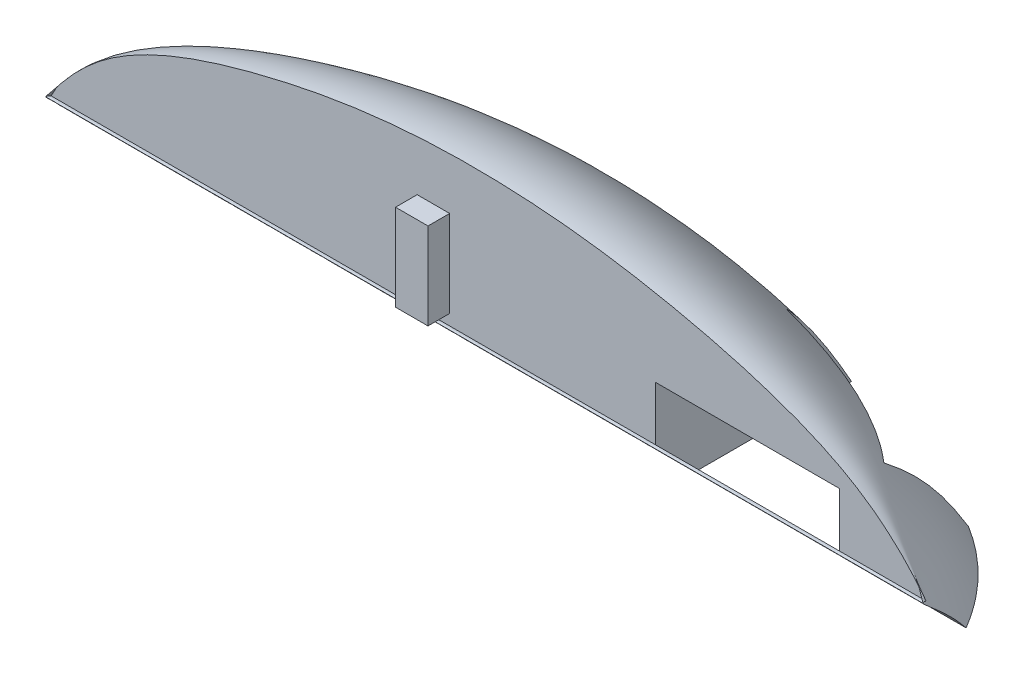
ISO-10303-21;
HEADER;
FILE_DESCRIPTION(('STEP AP214'),'2;1');
FILE_NAME('part.step','',(''),(''),'','','');
FILE_SCHEMA(('AUTOMOTIVE_DESIGN { 1 0 10303 214 1 1 1 1 }'));
ENDSEC;
DATA;
#1=APPLICATION_CONTEXT('core data for automotive mechanical design processes');
#2=APPLICATION_PROTOCOL_DEFINITION('international standard','automotive_design',2000,#1);
#3=PRODUCT_CONTEXT('',#1,'mechanical');
#4=PRODUCT('Part','Part','',(#3));
#5=PRODUCT_RELATED_PRODUCT_CATEGORY('part','',(#4));
#6=PRODUCT_DEFINITION_FORMATION('','',#4);
#7=PRODUCT_DEFINITION_CONTEXT('part definition',#1,'design');
#8=PRODUCT_DEFINITION('design','',#6,#7);
#9=PRODUCT_DEFINITION_SHAPE('','',#8);
#10=(LENGTH_UNIT() NAMED_UNIT(*) SI_UNIT(.MILLI.,.METRE.));
#11=(NAMED_UNIT(*) PLANE_ANGLE_UNIT() SI_UNIT($,.RADIAN.));
#12=(NAMED_UNIT(*) SI_UNIT($,.STERADIAN.) SOLID_ANGLE_UNIT());
#13=UNCERTAINTY_MEASURE_WITH_UNIT(LENGTH_MEASURE(1.E-05),#10,'distance_accuracy_value','');
#14=(GEOMETRIC_REPRESENTATION_CONTEXT(3) GLOBAL_UNCERTAINTY_ASSIGNED_CONTEXT((#13)) GLOBAL_UNIT_ASSIGNED_CONTEXT((#10,
#11,#12)) REPRESENTATION_CONTEXT('',''));
#15=CARTESIAN_POINT('',(0.,0.,0.));
#16=DIRECTION('',(0.,0.,1.));
#17=DIRECTION('',(1.,0.,0.));
#18=AXIS2_PLACEMENT_3D('',#15,#16,#17);
#19=CARTESIAN_POINT('',(20.25011525,25.453580483249,-30.));
#20=DIRECTION('',(0.,0.,1.));
#21=DIRECTION('',(-1.,0.,0.));
#22=AXIS2_PLACEMENT_3D('',#19,#20,#21);
#23=PLANE('',#22);
#24=DIRECTION('',(-1.,0.,0.));
#25=VECTOR('',#24,1.);
#26=CARTESIAN_POINT('',(36.5,24.5,-30.));
#27=LINE('',#26,#25);
#28=CARTESIAN_POINT('',(36.5,24.5,-30.));
#29=VERTEX_POINT('',#28);
#30=CARTESIAN_POINT('',(28.,24.5,-30.));
#31=VERTEX_POINT('',#30);
#32=EDGE_CURVE('E165',#29,#31,#27,.T.);
#33=ORIENTED_EDGE('',*,*,#32,.F.);
#34=DIRECTION('',(0.,-1.,0.));
#35=VECTOR('',#34,1.);
#36=CARTESIAN_POINT('',(36.5,24.5,-30.));
#37=LINE('',#36,#35);
#38=CARTESIAN_POINT('',(36.5,22.,-30.));
#39=VERTEX_POINT('',#38);
#40=EDGE_CURVE('E177',#29,#39,#37,.T.);
#41=ORIENTED_EDGE('',*,*,#40,.T.);
#42=CARTESIAN_POINT('',(40.5,22.,-30.));
#43=CARTESIAN_POINT('',(27.0000768333334,22.,-30.));
#44=CARTESIAN_POINT('',(13.5001536666667,22.,-30.));
#45=CARTESIAN_POINT('',(0.000230500000000689,22.,-30.));
#46=B_SPLINE_CURVE_WITH_KNOTS('',3,(#42,#43,#44,#45),.UNSPECIFIED.,.F.,.F.,(4,4),(0.,1.),.UNSPECIFIED.);
#47=CARTESIAN_POINT('',(40.5,22.,-30.));
#48=VERTEX_POINT('',#47);
#49=EDGE_CURVE('E279',#39,#48,#46,.F.);
#50=ORIENTED_EDGE('',*,*,#49,.T.);
#51=CARTESIAN_POINT('',(0.000230500000000689,22.,-30.));
#52=CARTESIAN_POINT('',(0.739150769022203,23.03726321863,-30.));
#53=CARTESIAN_POINT('',(3.12649338618059,25.6439685121812,-30.));
#54=CARTESIAN_POINT('',(11.4702662698805,28.4720776969719,-30.));
#55=CARTESIAN_POINT('',(19.7044952136281,29.2399964366831,-30.));
#56=CARTESIAN_POINT('',(28.4856403512339,28.2163806083618,-30.));
#57=CARTESIAN_POINT('',(36.7942535663366,25.8303513659763,-30.));
#58=CARTESIAN_POINT('',(39.5504796655932,23.244792146525,-30.));
#59=CARTESIAN_POINT('',(40.5,22.,-30.));
#60=B_SPLINE_CURVE_WITH_KNOTS('',3,(#51,#52,#53,#54,#55,#56,#57,#58,#59),.UNSPECIFIED.,.F.,.F.,
(4,1,1,1,1,1,4),(0.,0.087898590956398,0.25059951239453,0.529512710556187,0.714586405415059,
0.881767774039842,1.),.UNSPECIFIED.);
#61=CARTESIAN_POINT('',(0.000230500000000689,22.,-30.));
#62=VERTEX_POINT('',#61);
#63=EDGE_CURVE('E305',#48,#62,#60,.F.);
#64=ORIENTED_EDGE('',*,*,#63,.T.);
#65=CARTESIAN_POINT('',(40.5,22.,-30.));
#66=CARTESIAN_POINT('',(27.0000768333334,22.,-30.));
#67=CARTESIAN_POINT('',(13.5001536666667,22.,-30.));
#68=CARTESIAN_POINT('',(0.000230500000000689,22.,-30.));
#69=B_SPLINE_CURVE_WITH_KNOTS('',3,(#65,#66,#67,#68),.UNSPECIFIED.,.F.,.F.,(4,4),(0.,1.),.UNSPECIFIED.);
#70=CARTESIAN_POINT('',(28.,22.,-30.));
#71=VERTEX_POINT('',#70);
#72=EDGE_CURVE('E293',#62,#71,#69,.F.);
#73=ORIENTED_EDGE('',*,*,#72,.T.);
#74=DIRECTION('',(0.,-1.,0.));
#75=VECTOR('',#74,1.);
#76=CARTESIAN_POINT('',(28.,24.5,-30.));
#77=LINE('',#76,#75);
#78=EDGE_CURVE('E420',#31,#71,#77,.T.);
#79=ORIENTED_EDGE('',*,*,#78,.F.);
#80=EDGE_LOOP('',(#33,#41,#50,#64,#73,#79));
#81=FACE_BOUND('',#80,.T.);
#82=DIRECTION('',(-1.,0.,0.));
#83=VECTOR('',#82,1.);
#84=CARTESIAN_POINT('',(20.25011525,22.5,-30.));
#85=LINE('',#84,#83);
#86=CARTESIAN_POINT('',(18.5,22.5,-30.));
#87=VERTEX_POINT('',#86);
#88=CARTESIAN_POINT('',(17.,22.5,-30.));
#89=VERTEX_POINT('',#88);
#90=EDGE_CURVE('E409',#87,#89,#85,.T.);
#91=ORIENTED_EDGE('',*,*,#90,.T.);
#92=DIRECTION('',(0.,1.,0.));
#93=VECTOR('',#92,1.);
#94=CARTESIAN_POINT('',(17.,25.453580483249,-30.));
#95=LINE('',#94,#93);
#96=CARTESIAN_POINT('',(17.,26.5,-30.));
#97=VERTEX_POINT('',#96);
#98=EDGE_CURVE('E11',#89,#97,#95,.T.);
#99=ORIENTED_EDGE('',*,*,#98,.T.);
#100=DIRECTION('',(1.,0.,0.));
#101=VECTOR('',#100,1.);
#102=CARTESIAN_POINT('',(20.25011525,26.5,-30.));
#103=LINE('',#102,#101);
#104=CARTESIAN_POINT('',(18.5,26.5,-30.));
#105=VERTEX_POINT('',#104);
#106=EDGE_CURVE('E27',#97,#105,#103,.T.);
#107=ORIENTED_EDGE('',*,*,#106,.T.);
#108=DIRECTION('',(0.,-1.,0.));
#109=VECTOR('',#108,1.);
#110=CARTESIAN_POINT('',(18.5,25.453580483249,-30.));
#111=LINE('',#110,#109);
#112=EDGE_CURVE('E415',#105,#87,#111,.T.);
#113=ORIENTED_EDGE('',*,*,#112,.T.);
#114=EDGE_LOOP('',(#91,#99,#107,#113));
#115=FACE_BOUND('',#114,.T.);
#116=ADVANCED_FACE('F17',(#81,#115),#23,.T.);
#117=CARTESIAN_POINT('',(0.,20.,0.));
#118=DIRECTION('',(0.,1.,0.));
#119=DIRECTION('',(0.,0.,1.));
#120=AXIS2_PLACEMENT_3D('',#117,#118,#119);
#121=PLANE('',#120);
#122=DIRECTION('',(0.,0.,-1.));
#123=VECTOR('',#122,1.);
#124=CARTESIAN_POINT('',(28.,20.,-30.));
#125=LINE('',#124,#123);
#126=CARTESIAN_POINT('',(28.,20.,-31.8493692518598));
#127=VERTEX_POINT('',#126);
#128=CARTESIAN_POINT('',(28.,20.,-39.0596281540542));
#129=VERTEX_POINT('',#128);
#130=EDGE_CURVE('E156',#127,#129,#125,.T.);
#131=ORIENTED_EDGE('',*,*,#130,.F.);
#132=DIRECTION('',(1.,0.,0.));
#133=VECTOR('',#132,1.);
#134=CARTESIAN_POINT('',(20.2501152496914,20.,-31.8493692487916));
#135=LINE('',#134,#133);
#136=CARTESIAN_POINT('',(0.000230497181969574,20.,-31.8493692487916));
#137=VERTEX_POINT('',#136);
#138=EDGE_CURVE('E371',#137,#127,#135,.T.);
#139=ORIENTED_EDGE('',*,*,#138,.F.);
#140=CARTESIAN_POINT('',(18.7825989830446,19.9999999978192,-39.9999999920742));
#141=CARTESIAN_POINT('',(18.4673231550345,19.9999999992085,-39.9936145308374));
#142=CARTESIAN_POINT('',(18.1521331823791,19.999999999786,-39.9829764414258));
#143=CARTESIAN_POINT('',(17.5226090192361,20.0000000002137,-39.9530312704488));
#144=CARTESIAN_POINT('',(17.2082742484702,20.0000000000649,-39.9337363605383));
#145=CARTESIAN_POINT('',(16.4732250865418,19.9999999999129,-39.8782116963993));
#146=CARTESIAN_POINT('',(16.0527718918708,19.9999999999767,-39.8384512996698));
#147=CARTESIAN_POINT('',(15.213582565402,20.0000000000233,-39.7429387784612));
#148=CARTESIAN_POINT('',(14.7948469019338,20.0000000000063,-39.687182552734));
#149=CARTESIAN_POINT('',(13.9597670221921,19.9999999999937,-39.5599431591359));
#150=CARTESIAN_POINT('',(13.5434228489191,19.9999999999983,-39.4884597093827));
#151=CARTESIAN_POINT('',(12.7115695918937,20.0000000000017,-39.3299268132945));
#152=CARTESIAN_POINT('',(12.2960749612457,20.0000000000005,-39.242801714024));
#153=CARTESIAN_POINT('',(11.4684224640325,19.9999999999995,-39.0540004871884));
#154=CARTESIAN_POINT('',(11.0562645360078,19.9999999999999,-38.9523246282843));
#155=CARTESIAN_POINT('',(10.2355279821689,20.0000000000001,-38.7353845324986));
#156=CARTESIAN_POINT('',(9.82694954722567,20.,-38.6201195756807));
#157=CARTESIAN_POINT('',(9.09841260100675,20.,-38.4022243018996));
#158=CARTESIAN_POINT('',(8.77774219139659,20.,-38.3019720200288));
#159=CARTESIAN_POINT('',(8.13971269687509,20.,-38.0914823290324));
#160=CARTESIAN_POINT('',(7.82235317927318,20.,-37.9812462433613));
#161=CARTESIAN_POINT('',(7.19189902779983,20.,-37.7487588729626));
#162=CARTESIAN_POINT('',(6.87880605634362,20.,-37.6265030491478));
#163=CARTESIAN_POINT('',(6.26069593102699,20.,-37.3687546421392));
#164=CARTESIAN_POINT('',(5.95563704750669,20.,-37.2333629253999));
#165=CARTESIAN_POINT('',(5.35329288604292,20.,-36.9463270496865));
#166=CARTESIAN_POINT('',(5.05600585386223,20.,-36.7946865984211));
#167=CARTESIAN_POINT('',(4.47182811681479,20.,-36.4726666893887));
#168=CARTESIAN_POINT('',(4.18493243645207,20.,-36.302296361701));
#169=CARTESIAN_POINT('',(3.71673323049314,20.,-35.9995697467725));
#170=CARTESIAN_POINT('',(3.53165157254729,20.,-35.8730656807282));
#171=CARTESIAN_POINT('',(3.25971368206582,20.,-35.6755361068861));
#172=CARTESIAN_POINT('',(3.17002052259094,20.,-35.608401728672));
#173=CARTESIAN_POINT('',(2.99270105668744,20.,-35.471452255226));
#174=CARTESIAN_POINT('',(2.90507473745273,20.,-35.4016371766106));
#175=CARTESIAN_POINT('',(2.73212230000936,20.,-35.2592687155737));
#176=CARTESIAN_POINT('',(2.64679540450332,20.,-35.1867162789095));
#177=CARTESIAN_POINT('',(2.47860360423579,20.,-35.0388171415569));
#178=CARTESIAN_POINT('',(2.39573869949264,20.,-34.9634704408476));
#179=CARTESIAN_POINT('',(2.15075680793448,20.,-34.7333193982494));
#180=CARTESIAN_POINT('',(1.9923766070967,20.0000000000001,-34.5745062448021));
#181=CARTESIAN_POINT('',(1.68571710757864,19.9999999999999,-34.2473134713051));
#182=CARTESIAN_POINT('',(1.5374426886795,19.9999999999997,-34.0789293006639));
#183=CARTESIAN_POINT('',(1.2509494266091,20.0000000000003,-33.7338916703542));
#184=CARTESIAN_POINT('',(1.11272853076684,20.0000000000011,-33.5572399108883));
#185=CARTESIAN_POINT('',(0.79914320704978,19.9999999999985,-33.1334873873139));
#186=CARTESIAN_POINT('',(0.627779853671464,19.9999999999936,-32.8834311951474));
#187=CARTESIAN_POINT('',(0.301858369559208,20.0000000000064,-32.3733526592436));
#188=CARTESIAN_POINT('',(0.147263602268068,20.000000000024,-32.1133537925674));
#189=CARTESIAN_POINT('',(0.000230499691400271,20.0000000000674,-31.8493692424113));
#190=B_SPLINE_CURVE_WITH_KNOTS('',3,(#140,#141,#142,#143,#144,#145,#146,#147,#148,#149,#150,
#151,#152,#153,#154,#155,#156,#157,#158,#159,#160,#161,#162,#163,#164,#165,#166,#167,#168,#169,
#170,#171,#172,#173,#174,#175,#176,#177,#178,#179,#180,#181,#182,#183,#184,#185,#186,#187,#188,
#189),.UNSPECIFIED.,.F.,.F.,(4,2,2,2,2,2,2,2,2,2,2,2,2,2,2,2,2,2,2,2,2,2,2,2,4),(0.,
0.945990238946583,1.89065454564998,3.15732237117926,4.42431525449823,5.69133084825386,
6.96464825495112,8.23794215451415,9.51130354221055,10.5191140837438,11.5267912247493,
12.5348503734525,13.5357036751103,14.5363290819855,15.5364688681046,16.2086753238537,
16.5447369872613,16.8807965678924,17.2167410844742,17.5526856035576,18.225055548756,
18.8977478942763,19.5703025055057,20.4790304525625,21.3857311951022),.UNSPECIFIED.);
#191=CARTESIAN_POINT('',(18.7835162951009,20.,-40.));
#192=VERTEX_POINT('',#191);
#193=EDGE_CURVE('E339',#192,#137,#190,.T.);
#194=ORIENTED_EDGE('',*,*,#193,.F.);
#195=DIRECTION('',(-1.,0.,0.));
#196=VECTOR('',#195,1.);
#197=CARTESIAN_POINT('',(40.5,20.,-40.));
#198=LINE('',#197,#196);
#199=CARTESIAN_POINT('',(20.2499994144658,20.0000082664164,-40.0000150216028));
#200=VERTEX_POINT('',#199);
#201=EDGE_CURVE('E232',#200,#192,#198,.T.);
#202=ORIENTED_EDGE('',*,*,#201,.F.);
#203=CARTESIAN_POINT('',(40.4999999997161,16.6736548830317,-33.9554175833377));
#204=CARTESIAN_POINT('',(39.5504796650203,17.273796309124,-35.0459852136064));
#205=CARTESIAN_POINT('',(36.7942535651638,18.5203507651671,-37.3112045102973));
#206=CARTESIAN_POINT('',(28.4856403495073,19.6707074695508,-39.401614754483));
#207=CARTESIAN_POINT('',(19.704495211664,20.1642149708474,-40.2984088813494));
#208=CARTESIAN_POINT('',(11.4702662680946,19.7939846074181,-39.6256320448502));
#209=CARTESIAN_POINT('',(3.12649338505101,18.4304915250546,-37.1479137020203));
#210=CARTESIAN_POINT('',(0.739150768497569,17.1737420851977,-34.8641682399041));
#211=CARTESIAN_POINT('',(0.000230499716088509,16.6736548785001,-33.9554175751033));
#212=B_SPLINE_CURVE_WITH_KNOTS('',3,(#203,#204,#205,#206,#207,#208,#209,#210,#211),
.UNSPECIFIED.,.F.,.F.,(4,1,1,1,1,1,4),(0.,0.118232225960158,0.285413594584941,0.470487289443813,
0.74940048760547,0.912101409043602,1.),.UNSPECIFIED.);
#213=CARTESIAN_POINT('',(20.2540027573121,19.9999916122397,-39.9999847578929));
#214=VERTEX_POINT('',#213);
#215=EDGE_CURVE('E334',#214,#200,#212,.T.);
#216=ORIENTED_EDGE('',*,*,#215,.F.);
#217=CARTESIAN_POINT('',(40.4999999996914,20.0000000001187,-31.849369254928));
#218=CARTESIAN_POINT('',(40.4456788618527,20.0000000000428,-31.9404736822134));
#219=CARTESIAN_POINT('',(40.3903350398536,20.0000000000115,-32.0309744407622));
#220=CARTESIAN_POINT('',(40.2775784913579,19.9999999999885,-32.2106650972197));
#221=CARTESIAN_POINT('',(40.2201659681718,19.9999999999968,-32.29985512274));
#222=CARTESIAN_POINT('',(40.1032428960012,20.0000000000032,-32.4768310393799));
#223=CARTESIAN_POINT('',(40.0437325287336,20.0000000000012,-32.5646170511633));
#224=CARTESIAN_POINT('',(39.8012643206628,19.9999999999963,-32.912979140251));
#225=CARTESIAN_POINT('',(39.6096586715204,19.9999999999992,-33.1676712129529));
#226=CARTESIAN_POINT('',(39.2720037145106,20.0000000000005,-33.581131742151));
#227=CARTESIAN_POINT('',(39.1312672585176,20.0000000000001,-33.7442788249879));
#228=CARTESIAN_POINT('',(38.840886749941,19.9999999999999,-34.0625648675241));
#229=CARTESIAN_POINT('',(38.6912399726672,20.,-34.2177013502992));
#230=CARTESIAN_POINT('',(38.3834239009352,20.,-34.5192323464502));
#231=CARTESIAN_POINT('',(38.2252557241043,20.,-34.6656280009486));
#232=CARTESIAN_POINT('',(37.9008449280116,20.,-34.94924661779));
#233=CARTESIAN_POINT('',(37.7346006200494,20.,-35.0864676473625));
#234=CARTESIAN_POINT('',(37.3947065034437,20.,-35.3514296101557));
#235=CARTESIAN_POINT('',(37.2210564798882,20.,-35.4791702679635));
#236=CARTESIAN_POINT('',(36.9556074897127,20.,-35.663571788321));
#237=CARTESIAN_POINT('',(36.8662914868849,20.,-35.7238398613313));
#238=CARTESIAN_POINT('',(36.6861169502157,20.,-35.8420310141942));
#239=CARTESIAN_POINT('',(36.5952583702901,20.,-35.899954023813));
#240=CARTESIAN_POINT('',(36.3503127755092,20.,-36.0519992661687));
#241=CARTESIAN_POINT('',(36.1949886892471,20.,-36.1441332323484));
#242=CARTESIAN_POINT('',(35.8811413972902,20.,-36.3227800249888));
#243=CARTESIAN_POINT('',(35.722617885367,20.,-36.4092923100023));
#244=CARTESIAN_POINT('',(35.2427593107097,20.,-36.6613275360255));
#245=CARTESIAN_POINT('',(34.917388270314,20.,-36.8191952315444));
#246=CARTESIAN_POINT('',(34.2588633494019,20.,-37.1179628044953));
#247=CARTESIAN_POINT('',(33.9257056832928,20.,-37.2588542147692));
#248=CARTESIAN_POINT('',(33.2517433503016,20.,-37.5270181167959));
#249=CARTESIAN_POINT('',(32.9109055230177,20.,-37.6542068178274));
#250=CARTESIAN_POINT('',(32.225108856402,20.,-37.8960382640916));
#251=CARTESIAN_POINT('',(31.8801531054112,20.,-38.0106898276082));
#252=CARTESIAN_POINT('',(31.1869028389962,20.,-38.2291961284611));
#253=CARTESIAN_POINT('',(30.8386087220515,20.,-38.3330521372881));
#254=CARTESIAN_POINT('',(30.0750797699906,20.,-38.5495158046022));
#255=CARTESIAN_POINT('',(29.6593070569421,20.,-38.6602236991153));
#256=CARTESIAN_POINT('',(29.0334958551283,20.,-38.8177001865078));
#257=CARTESIAN_POINT('',(28.8245232975736,20.,-38.8687637132413));
#258=CARTESIAN_POINT('',(28.4058842866439,20.,-38.9679610138526));
#259=CARTESIAN_POINT('',(28.1962178383448,20.,-39.0160948091114));
#260=CARTESIAN_POINT('',(27.5680698446919,20.,-39.1554643809518));
#261=CARTESIAN_POINT('',(27.1485657565305,20.,-39.2421419782322));
#262=CARTESIAN_POINT('',(26.3070697471562,20.,-39.4023321547466));
#263=CARTESIAN_POINT('',(25.8850779836666,20.,-39.4758455595371));
#264=CARTESIAN_POINT('',(25.1754380488316,20.,-39.5874539646822));
#265=CARTESIAN_POINT('',(24.8883795567118,20.,-39.6293233080992));
#266=CARTESIAN_POINT('',(24.3133681970171,20.,-39.7065020944657));
#267=CARTESIAN_POINT('',(24.0254152964494,20.,-39.741811292434));
#268=CARTESIAN_POINT('',(23.4487644995293,20.,-39.8057769994519));
#269=CARTESIAN_POINT('',(23.1600665847809,20.,-39.8344333426102));
#270=CARTESIAN_POINT('',(22.5804828410065,20.,-39.8852398386457));
#271=CARTESIAN_POINT('',(22.2895937693376,20.,-39.9073529481434));
#272=CARTESIAN_POINT('',(21.7073904931713,20.,-39.9449644388807));
#273=CARTESIAN_POINT('',(21.4160762929801,20.,-39.9604628866606));
#274=CARTESIAN_POINT('',(20.9789158048458,20.,-39.9789316296431));
#275=CARTESIAN_POINT('',(20.8331665245896,20.,-39.9842913400283));
#276=CARTESIAN_POINT('',(20.541617647598,20.,-39.9933791073756));
#277=CARTESIAN_POINT('',(20.3958180510267,20.,-39.9971071696109));
#278=CARTESIAN_POINT('',(20.2500000000005,20.,-40.));
#279=B_SPLINE_CURVE_WITH_KNOTS('',3,(#217,#218,#219,#220,#221,#222,#223,#224,#225,#226,#227,
#228,#229,#230,#231,#232,#233,#234,#235,#236,#237,#238,#239,#240,#241,#242,#243,#244,#245,#246,
#247,#248,#249,#250,#251,#252,#253,#254,#255,#256,#257,#258,#259,#260,#261,#262,#263,#264,#265,
#266,#267,#268,#269,#270,#271,#272,#273,#274,#275,#276,#277,#278),.UNSPECIFIED.,.F.,.F.,(4,2,2,
2,2,2,2,2,2,2,2,2,2,2,2,2,2,2,2,2,2,2,2,2,2,2,2,2,2,2,4),(0.,0.318212264480111,
0.636393340139591,0.954546922108443,1.90957814873258,2.55567667621228,3.20197379928719,
3.84818636240443,4.4945346336026,5.14090167443684,5.4641134576125,5.78733491372048,
6.32897358133186,6.87066433930362,7.95492963805252,9.03973351006887,10.1308336116052,
11.221161258186,12.3113603411105,13.6019308942755,14.2472784502336,14.8926212959345,
16.1775107104988,17.4623195184718,18.3325380105599,19.2027889934474,20.0730616740516,
20.9481709145772,21.8232713517054,22.260807087793,22.6983414098539),.UNSPECIFIED.);
#280=EDGE_CURVE('E340',#129,#214,#279,.T.);
#281=ORIENTED_EDGE('',*,*,#280,.F.);
#282=EDGE_LOOP('',(#131,#139,#194,#202,#216,#281));
#283=FACE_BOUND('',#282,.T.);
#284=ADVANCED_FACE('F216',(#283),#121,.F.);
#285=DIRECTION('',(0.,0.,1.));
#286=VECTOR('',#285,1.);
#287=CARTESIAN_POINT('',(36.5,20.,-39.5898905600885));
#288=LINE('',#287,#286);
#289=CARTESIAN_POINT('',(36.5,20.,-35.9590830150765));
#290=VERTEX_POINT('',#289);
#291=CARTESIAN_POINT('',(36.5,20.,-31.8493692518598));
#292=VERTEX_POINT('',#291);
#293=EDGE_CURVE('E161',#290,#292,#288,.T.);
#294=ORIENTED_EDGE('',*,*,#293,.F.);
#295=CARTESIAN_POINT('',(40.5,20.,-31.849369254928));
#296=VERTEX_POINT('',#295);
#297=EDGE_CURVE('E335',#296,#290,#279,.T.);
#298=ORIENTED_EDGE('',*,*,#297,.F.);
#299=EDGE_CURVE('E366',#292,#296,#135,.T.);
#300=ORIENTED_EDGE('',*,*,#299,.F.);
#301=EDGE_LOOP('',(#294,#298,#300));
#302=FACE_BOUND('',#301,.T.);
#303=ADVANCED_FACE('F450',(#302),#121,.F.);
#304=CARTESIAN_POINT('',(20.2501152489146,18.3387013083919,-36.9811139533019));
#305=DIRECTION('',(0.,0.876104202220531,0.482121796698228));
#306=DIRECTION('',(-1.,-1.11891773624251E-10,2.0331852867983E-10));
#307=AXIS2_PLACEMENT_3D('',#304,#305,#306);
#308=PLANE('',#307);
#309=CARTESIAN_POINT('',(40.4999999997161,16.6736548830317,-33.9554175833377));
#310=CARTESIAN_POINT('',(39.5504796650203,17.273796309124,-35.0459852136064));
#311=CARTESIAN_POINT('',(36.7942535651638,18.5203507651671,-37.3112045102973));
#312=CARTESIAN_POINT('',(28.4856403495073,19.6707074695508,-39.401614754483));
#313=CARTESIAN_POINT('',(19.704495211664,20.1642149708474,-40.2984088813494));
#314=CARTESIAN_POINT('',(11.4702662680946,19.7939846074181,-39.6256320448502));
#315=CARTESIAN_POINT('',(3.12649338505101,18.4304915250546,-37.1479137020203));
#316=CARTESIAN_POINT('',(0.739150768497569,17.1737420851977,-34.8641682399041));
#317=CARTESIAN_POINT('',(0.000230499716088509,16.6736548785001,-33.9554175751033));
#318=B_SPLINE_CURVE_WITH_KNOTS('',3,(#309,#310,#311,#312,#313,#314,#315,#316,#317),
.UNSPECIFIED.,.F.,.F.,(4,1,1,1,1,1,4),(0.,0.118232225960158,0.285413594584941,0.470487289443813,
0.74940048760547,0.912101409043602,1.),.UNSPECIFIED.);
#319=EDGE_CURVE('E306',#192,#200,#318,.F.);
#320=ORIENTED_EDGE('',*,*,#319,.T.);
#321=ORIENTED_EDGE('',*,*,#201,.T.);
#322=EDGE_LOOP('',(#320,#321));
#323=FACE_BOUND('',#322,.T.);
#324=ADVANCED_FACE('F19',(#323),#308,.F.);
#325=CARTESIAN_POINT('',(0.000230500000000689,22.,-30.));
#326=CARTESIAN_POINT('',(0.000230500000000652,22.,-29.9948388900879));
#327=CARTESIAN_POINT('',(0.000230500163543397,22.1160702352584,-29.6051916335395));
#328=CARTESIAN_POINT('',(0.000230499507954534,21.2652746975059,-30.7053325517347));
#329=CARTESIAN_POINT('',(0.000230499770870856,19.8719744469128,-32.0768283929598));
#330=CARTESIAN_POINT('',(0.000230499716082116,17.8853002770691,-33.2886468245025));
#331=CARTESIAN_POINT('',(0.000230499716088509,16.6736548785001,-33.9554175751033));
#332=CARTESIAN_POINT('',(13.5001536666667,22.,-30.));
#333=CARTESIAN_POINT('',(13.5001536666667,22.,-29.9948388928607));
#334=CARTESIAN_POINT('',(13.5001536668302,22.1160702342329,-29.6051916397553));
#335=CARTESIAN_POINT('',(13.5001536661746,21.2652746983509,-30.7053325555318));
#336=CARTESIAN_POINT('',(13.5001536664375,19.8719744494963,-32.0768283950455));
#337=CARTESIAN_POINT('',(13.5001536663827,17.8853002785015,-33.2886468272902));
#338=CARTESIAN_POINT('',(13.5001536663828,16.6736548800107,-33.9554175778482));
#339=CARTESIAN_POINT('',(27.0000768333334,22.,-30.));
#340=CARTESIAN_POINT('',(27.0000768333334,22.,-29.9948388956336));
#341=CARTESIAN_POINT('',(27.0000768334969,22.1160702332072,-29.605191645971));
#342=CARTESIAN_POINT('',(27.0000768328413,21.2652746991957,-30.7053325593289));
#343=CARTESIAN_POINT('',(27.0000768331042,19.8719744520799,-32.0768283971311));
#344=CARTESIAN_POINT('',(27.0000768330494,17.885300279934,-33.288646830078));
#345=CARTESIAN_POINT('',(27.0000768330494,16.6736548815212,-33.955417580593));
#346=CARTESIAN_POINT('',(40.5,22.,-30.));
#347=CARTESIAN_POINT('',(40.5,22.,-29.9948388984064));
#348=CARTESIAN_POINT('',(40.5000000001636,22.1160702321816,-29.6051916521867));
#349=CARTESIAN_POINT('',(40.4999999995079,21.2652747000406,-30.7053325631259));
#350=CARTESIAN_POINT('',(40.4999999997708,19.8719744546634,-32.0768283992168));
#351=CARTESIAN_POINT('',(40.4999999997161,17.8853002813665,-33.2886468328657));
#352=CARTESIAN_POINT('',(40.4999999997161,16.6736548830317,-33.9554175833377));
#353=B_SPLINE_SURFACE_WITH_KNOTS('',3,3,((#325,#326,#327,#328,#329,#330,#331),(#332,#333,#334,
#335,#336,#337,#338),(#339,#340,#341,#342,#343,#344,#345),(#346,#347,#348,#349,#350,#351,#352)),
.UNSPECIFIED.,.F.,.F.,.F.,(4,4),(4,1,1,1,4),(0.,1.),(0.,0.251024544191798,0.502049088383596,
0.789400842037647,1.),.UNSPECIFIED.);
#354=CARTESIAN_POINT('',(28.,19.9999999983778,-31.8493692525116));
#355=CARTESIAN_POINT('',(28.,20.0843239901892,-31.781876835971));
#356=CARTESIAN_POINT('',(28.,20.1676877498022,-31.7131716864434));
#357=CARTESIAN_POINT('',(28.,20.3322817818546,-31.5732122792395));
#358=CARTESIAN_POINT('',(28.,20.4135115124514,-31.5019573848111));
#359=CARTESIAN_POINT('',(28.,20.5733451397897,-31.3570232986178));
#360=CARTESIAN_POINT('',(28.,20.6519560911265,-31.2833518988936));
#361=CARTESIAN_POINT('',(28.,20.8066477399576,-31.1334004742009));
#362=CARTESIAN_POINT('',(28.,20.8827284776954,-31.0571204907614));
#363=CARTESIAN_POINT('',(28.,21.0080461403162,-30.9273667911329));
#364=CARTESIAN_POINT('',(28.,21.0579634655945,-30.8745473601886));
#365=CARTESIAN_POINT('',(28.,21.156767201683,-30.7679427897169));
#366=CARTESIAN_POINT('',(28.,21.2056534944974,-30.7141575409473));
#367=CARTESIAN_POINT('',(28.,21.3025849705042,-30.6058156249156));
#368=CARTESIAN_POINT('',(28.,21.3506299686538,-30.5512587925977));
#369=CARTESIAN_POINT('',(28.,21.4462299430441,-30.4414372315934));
#370=CARTESIAN_POINT('',(28.,21.4937830650554,-30.3861708941198));
#371=CARTESIAN_POINT('',(28.,21.5648927678227,-30.3030929295848));
#372=CARTESIAN_POINT('',(28.,21.5885571586536,-30.2753731055125));
#373=CARTESIAN_POINT('',(28.,21.6358871297721,-30.2199351132555));
#374=CARTESIAN_POINT('',(28.,21.6595527100395,-30.1922169450537));
#375=CARTESIAN_POINT('',(28.,21.7069816317011,-30.1368894934578));
#376=CARTESIAN_POINT('',(28.,21.7307449142885,-30.1092801599176));
#377=CARTESIAN_POINT('',(28.,21.7666287261304,-30.0680720890261));
#378=CARTESIAN_POINT('',(28.,21.7786301398122,-30.0543700185062));
#379=CARTESIAN_POINT('',(28.,21.8027673707281,-30.0270839075331));
#380=CARTESIAN_POINT('',(28.,21.8149031936013,-30.0134998720748));
#381=CARTESIAN_POINT('',(28.,21.8271332099329,-30.));
#382=B_SPLINE_CURVE_WITH_KNOTS('',3,(#354,#355,#356,#357,#358,#359,#360,#361,#362,#363,#364,
#365,#366,#367,#368,#369,#370,#371,#372,#373,#374,#375,#376,#377,#378,#379,#380,#381),
.UNSPECIFIED.,.F.,.F.,(4,2,2,2,2,2,2,2,2,2,2,2,2,4),(0.,0.324025691894997,0.648132875892582,
0.971281634922738,1.29442525176533,1.51243568272557,1.73047092981699,1.94855354613446,
2.16727684062388,2.27661824984386,2.38595819496952,2.49523988248875,2.54988368741002,
2.60452979359153),.UNSPECIFIED.);
#383=CARTESIAN_POINT('',(28.,21.8271332074617,-30.));
#384=VERTEX_POINT('',#383);
#385=EDGE_CURVE('E225',#127,#384,#382,.T.);
#386=DIRECTION('',(1.,0.,0.));
#387=VECTOR('',#386,1.);
#388=CARTESIAN_POINT('',(20.2501152499384,21.8271332074617,-29.9999999999972));
#389=LINE('',#388,#387);
#390=CARTESIAN_POINT('',(36.5,21.8271332074617,-30.));
#391=VERTEX_POINT('',#390);
#392=EDGE_CURVE('E404',#384,#391,#389,.T.);
#393=CARTESIAN_POINT('',(36.5,21.8271332126461,-30.));
#394=CARTESIAN_POINT('',(36.5,21.8128782759767,-30.015740764839));
#395=CARTESIAN_POINT('',(36.5,21.7987474626214,-30.0315921022985));
#396=CARTESIAN_POINT('',(36.5,21.7706562900443,-30.0634439358196));
#397=CARTESIAN_POINT('',(36.5,21.7566959222998,-30.0794444243521));
#398=CARTESIAN_POINT('',(36.5,21.7149562295294,-30.1275588051827));
#399=CARTESIAN_POINT('',(36.5,21.6873137138612,-30.1597907964567));
#400=CARTESIAN_POINT('',(36.5,21.6321354766198,-30.2243079644002));
#401=CARTESIAN_POINT('',(36.5,21.6045996955082,-30.2565930904183));
#402=CARTESIAN_POINT('',(36.5,21.5494745200633,-30.3211241421602));
#403=CARTESIAN_POINT('',(36.5,21.5218851196667,-30.3533700626889));
#404=CARTESIAN_POINT('',(36.5,21.4184539720062,-30.4737061714788));
#405=CARTESIAN_POINT('',(36.5,21.3421367532789,-30.5613919992475));
#406=CARTESIAN_POINT('',(36.5,21.1873286225927,-30.7348281207941));
#407=CARTESIAN_POINT('',(36.5,21.1088378439017,-30.820578532656));
#408=CARTESIAN_POINT('',(36.5,20.9490418392496,-30.989385753511));
#409=CARTESIAN_POINT('',(36.5,20.8677373095092,-31.0724432191201));
#410=CARTESIAN_POINT('',(36.5,20.7019766412295,-31.2357364899881));
#411=CARTESIAN_POINT('',(36.5,20.6175137741799,-31.3159654697783));
#412=CARTESIAN_POINT('',(36.5,20.4457213507671,-31.473392454693));
#413=CARTESIAN_POINT('',(36.5,20.3583901116813,-31.5505886201346));
#414=CARTESIAN_POINT('',(36.5,20.1810824485317,-31.7021222570832));
#415=CARTESIAN_POINT('',(36.5,20.0911027231007,-31.7764558688973));
#416=CARTESIAN_POINT('',(36.5,20.,-31.8493692538685));
#417=B_SPLINE_CURVE_WITH_KNOTS('',3,(#393,#394,#395,#396,#397,#398,#399,#400,#401,#402,#403,
#404,#405,#406,#407,#408,#409,#410,#411,#412,#413,#414,#415,#416),.UNSPECIFIED.,.F.,.F.,(4,2,2,
2,2,2,2,2,2,2,2,4),(0.,0.0637059523027047,0.127408705974231,0.25479342176762,0.382092066691871,
0.509406058261527,0.858123550406088,1.20681970871032,1.55543019572867,1.90483119073564,
2.2544409565566,2.60450669238659),.UNSPECIFIED.);
#418=EDGE_CURVE('E191',#391,#292,#417,.T.);
#419=CARTESIAN_POINT('',(40.5,22.,-30.));
#420=CARTESIAN_POINT('',(40.5,22.,-29.9948388984064));
#421=CARTESIAN_POINT('',(40.5000000001636,22.1160702321816,-29.6051916521867));
#422=CARTESIAN_POINT('',(40.4999999995079,21.2652747000406,-30.7053325631259));
#423=CARTESIAN_POINT('',(40.4999999997708,19.8719744546634,-32.0768283992168));
#424=CARTESIAN_POINT('',(40.4999999997161,17.8853002813665,-33.2886468328657));
#425=CARTESIAN_POINT('',(40.4999999997161,16.6736548830317,-33.9554175833377));
#426=B_SPLINE_CURVE_WITH_KNOTS('',3,(#419,#420,#421,#422,#423,#424,#425),.UNSPECIFIED.,.F.,.F.,
(4,1,1,1,4),(0.,0.251024544191798,0.502049088383596,0.789400842037647,1.),.UNSPECIFIED.);
#427=EDGE_CURVE('E318',#296,#48,#426,.F.);
#428=CARTESIAN_POINT('',(40.5,22.,-30.));
#429=CARTESIAN_POINT('',(27.0000768333334,22.,-30.));
#430=CARTESIAN_POINT('',(13.5001536666667,22.,-30.));
#431=CARTESIAN_POINT('',(0.000230500000000689,22.,-30.));
#432=B_SPLINE_CURVE_WITH_KNOTS('',3,(#428,#429,#430,#431),.UNSPECIFIED.,.F.,.F.,(4,4),(0.,1.),.UNSPECIFIED.);
#433=EDGE_CURVE('E270',#39,#71,#432,.T.);
#434=CARTESIAN_POINT('',(0.000230500000000689,22.,-30.));
#435=CARTESIAN_POINT('',(0.000230500000000652,22.,-29.9948388900879));
#436=CARTESIAN_POINT('',(0.000230500163543397,22.1160702352584,-29.6051916335395));
#437=CARTESIAN_POINT('',(0.000230499507954534,21.2652746975059,-30.7053325517347));
#438=CARTESIAN_POINT('',(0.000230499770870856,19.8719744469128,-32.0768283929598));
#439=CARTESIAN_POINT('',(0.000230499716082116,17.8853002770691,-33.2886468245025));
#440=CARTESIAN_POINT('',(0.000230499716088509,16.6736548785001,-33.9554175751033));
#441=B_SPLINE_CURVE_WITH_KNOTS('',3,(#434,#435,#436,#437,#438,#439,#440),.UNSPECIFIED.,.F.,.F.,
(4,1,1,1,4),(0.,0.251024544191798,0.502049088383596,0.789400842037647,1.),.UNSPECIFIED.);
#442=EDGE_CURVE('E298',#62,#137,#441,.T.);
#443=ORIENTED_EDGE('',*,*,#138,.T.);
#444=ORIENTED_EDGE('',*,*,#385,.T.);
#445=ORIENTED_EDGE('',*,*,#392,.T.);
#446=ORIENTED_EDGE('',*,*,#418,.T.);
#447=ORIENTED_EDGE('',*,*,#299,.T.);
#448=ORIENTED_EDGE('',*,*,#427,.T.);
#449=ORIENTED_EDGE('',*,*,#49,.F.);
#450=ORIENTED_EDGE('',*,*,#433,.T.);
#451=ORIENTED_EDGE('',*,*,#72,.F.);
#452=ORIENTED_EDGE('',*,*,#442,.T.);
#453=EDGE_LOOP('',(#443,#444,#445,#446,#447,#448,#449,#450,#451,#452));
#454=FACE_BOUND('',#453,.T.);
#455=ADVANCED_FACE('F234',(#454),#353,.F.);
#456=CARTESIAN_POINT('',(40.5,22.,-30.));
#457=CARTESIAN_POINT('',(40.5,22.,-29.9948388984064));
#458=CARTESIAN_POINT('',(40.5000000001636,22.1160702321816,-29.6051916521867));
#459=CARTESIAN_POINT('',(40.4999999995079,21.2652747000406,-30.7053325631259));
#460=CARTESIAN_POINT('',(40.4999999997708,19.8719744546634,-32.0768283992168));
#461=CARTESIAN_POINT('',(40.4999999997161,17.8853002813665,-33.2886468328657));
#462=CARTESIAN_POINT('',(40.4999999997161,16.6736548830317,-33.9554175833377));
#463=CARTESIAN_POINT('',(39.5504796655932,23.244792146525,-30.));
#464=CARTESIAN_POINT('',(39.5504796655932,23.244792146525,-30.1763016030752));
#465=CARTESIAN_POINT('',(39.5504796655903,23.2427797851213,-30.183057091236));
#466=CARTESIAN_POINT('',(39.5504796647856,22.1984805304532,-31.5334124820696));
#467=CARTESIAN_POINT('',(39.5504796650792,20.6428300899104,-33.0647178189461));
#468=CARTESIAN_POINT('',(39.5504796650203,18.5097903198532,-34.3658153757598));
#469=CARTESIAN_POINT('',(39.5504796650203,17.273796309124,-35.0459852136064));
#470=CARTESIAN_POINT('',(36.7942535663366,25.8303513659763,-30.));
#471=CARTESIAN_POINT('',(36.7942535663366,25.8303513659763,-30.5532179984366));
#472=CARTESIAN_POINT('',(36.7942535659882,25.5830695117666,-31.3833420683369));
#473=CARTESIAN_POINT('',(36.7942535648738,24.1368434492296,-33.2534182473451));
#474=CARTESIAN_POINT('',(36.794253565231,22.2439752288444,-35.1166640848019));
#475=CARTESIAN_POINT('',(36.7942535651638,19.8069193071052,-36.6032034124341));
#476=CARTESIAN_POINT('',(36.7942535651638,18.5203507651671,-37.3112045102973));
#477=CARTESIAN_POINT('',(28.4856403512339,28.2163806083618,-30.));
#478=CARTESIAN_POINT('',(28.4856403512339,28.2163806083618,-30.9010474085849));
#479=CARTESIAN_POINT('',(28.4856403505666,27.7427569335644,-32.4909999499086));
#480=CARTESIAN_POINT('',(28.4856403491663,25.9256211228675,-34.8406895880872));
#481=CARTESIAN_POINT('',(28.4856403495823,23.7215585273459,-37.0102597738894));
#482=CARTESIAN_POINT('',(28.4856403495073,21.0039476597586,-38.6679301604541));
#483=CARTESIAN_POINT('',(28.4856403495073,19.6707074695508,-39.401614754483));
#484=CARTESIAN_POINT('',(19.7044952136281,29.2399964366831,-30.));
#485=CARTESIAN_POINT('',(19.7044952136281,29.2399964366831,-31.050267577769));
#486=CARTESIAN_POINT('',(19.704495212824,28.6692712406205,-32.966189488272));
#487=CARTESIAN_POINT('',(19.7044952113011,26.6930137041394,-35.5216351674041));
#488=CARTESIAN_POINT('',(19.7044952117422,24.3554475102467,-37.8226196911258));
#489=CARTESIAN_POINT('',(19.704495211664,21.5174774797784,-39.5537059675218));
#490=CARTESIAN_POINT('',(19.704495211664,20.1642149708474,-40.2984088813494));
#491=CARTESIAN_POINT('',(11.4702662698805,28.4720776969719,-30.));
#492=CARTESIAN_POINT('',(11.4702662698805,28.4720776969718,-30.9383222910656));
#493=CARTESIAN_POINT('',(11.470266269179,27.9741982667948,-32.6097012938603));
#494=CARTESIAN_POINT('',(11.4702662677482,26.1173141804323,-35.0107883624989));
#495=CARTESIAN_POINT('',(11.4702662681704,23.8799026639269,-37.2131855763729));
#496=CARTESIAN_POINT('',(11.4702662680946,21.1322263309656,-38.8891950975808));
#497=CARTESIAN_POINT('',(11.4702662680946,19.7939846074181,-39.6256320448502));
#498=CARTESIAN_POINT('',(3.12649338618059,25.6439685121812,-30.));
#499=CARTESIAN_POINT('',(3.1264933861806,25.6439685121812,-30.5260475623985));
#500=CARTESIAN_POINT('',(3.12649338585709,25.4143671792013,-31.2968182022298));
#501=CARTESIAN_POINT('',(3.12649338476501,23.9971144438932,-33.1294297479547));
#502=CARTESIAN_POINT('',(3.12649338511761,22.1285549302697,-34.968747297008));
#503=CARTESIAN_POINT('',(3.12649338505101,19.7134143469956,-36.4419188507552));
#504=CARTESIAN_POINT('',(3.12649338505101,18.4304915250546,-37.1479137020203));
#505=CARTESIAN_POINT('',(0.739150769022203,23.03726321863,-30.));
#506=CARTESIAN_POINT('',(0.739150769022204,23.03726321863,-30.1460485438624));
#507=CARTESIAN_POINT('',(0.739150769047106,23.0549373227969,-30.0867166558444));
#508=CARTESIAN_POINT('',(0.73915076826727,22.042898565169,-31.3953568621708));
#509=CARTESIAN_POINT('',(0.739150768555714,20.5143147765108,-32.9000191258977));
#510=CARTESIAN_POINT('',(0.739150768497562,18.4056767506301,-34.1862322674391));
#511=CARTESIAN_POINT('',(0.739150768497569,17.1737420851977,-34.8641682399041));
#512=CARTESIAN_POINT('',(0.000230500000000689,22.,-30.));
#513=CARTESIAN_POINT('',(0.000230500000000652,22.,-29.9948388900879));
#514=CARTESIAN_POINT('',(0.000230500163543397,22.1160702352584,-29.6051916335395));
#515=CARTESIAN_POINT('',(0.000230499507954534,21.2652746975059,-30.7053325517347));
#516=CARTESIAN_POINT('',(0.000230499770870856,19.8719744469128,-32.0768283929598));
#517=CARTESIAN_POINT('',(0.000230499716082116,17.8853002770691,-33.2886468245025));
#518=CARTESIAN_POINT('',(0.000230499716088509,16.6736548785001,-33.9554175751033));
#519=B_SPLINE_SURFACE_WITH_KNOTS('',3,3,((#456,#457,#458,#459,#460,#461,#462),(#463,#464,#465,
#466,#467,#468,#469),(#470,#471,#472,#473,#474,#475,#476),(#477,#478,#479,#480,#481,#482,#483),
(#484,#485,#486,#487,#488,#489,#490),(#491,#492,#493,#494,#495,#496,#497),(#498,#499,#500,#501,
#502,#503,#504),(#505,#506,#507,#508,#509,#510,#511),(#512,#513,#514,#515,#516,#517,#518)),
.UNSPECIFIED.,.F.,.F.,.F.,(4,1,1,1,1,1,4),(4,1,1,1,4),(0.,0.118232225960158,0.285413594584941,
0.470487289443813,0.74940048760547,0.912101409043602,1.),(0.,0.251024544191798,
0.502049088383596,0.789400842037647,1.),.UNSPECIFIED.);
#520=CARTESIAN_POINT('',(28.,24.5,-35.9859099784339));
#521=CARTESIAN_POINT('',(28.1625114469107,24.5,-35.9435067130643));
#522=CARTESIAN_POINT('',(28.3247210973018,24.5,-35.8999506547608));
#523=CARTESIAN_POINT('',(28.6485095446194,24.5,-35.8105968369428));
#524=CARTESIAN_POINT('',(28.8100883854677,24.5,-35.7647992366198));
#525=CARTESIAN_POINT('',(29.1325985077148,24.5,-35.67102382245));
#526=CARTESIAN_POINT('',(29.293529838335,24.5,-35.6230461778662));
#527=CARTESIAN_POINT('',(29.6146867188314,24.5,-35.5248249020959));
#528=CARTESIAN_POINT('',(29.774912322257,24.5,-35.4745814462034));
#529=CARTESIAN_POINT('',(30.0931093510434,24.5,-35.3721520845052));
#530=CARTESIAN_POINT('',(30.2510879261137,24.5,-35.3199884134275));
#531=CARTESIAN_POINT('',(30.5662011538017,24.5,-35.2131414207285));
#532=CARTESIAN_POINT('',(30.723335760176,24.5,-35.1584579625822));
#533=CARTESIAN_POINT('',(31.036678047452,24.5,-35.04640448021));
#534=CARTESIAN_POINT('',(31.1928855534676,24.5,-34.9890339661829));
#535=CARTESIAN_POINT('',(31.504282808053,24.5,-34.8714226462825));
#536=CARTESIAN_POINT('',(31.6594721568438,24.5,-34.8111807817054));
#537=CARTESIAN_POINT('',(32.0228667685711,24.5,-34.6659973846207));
#538=CARTESIAN_POINT('',(32.2305743442619,24.5,-34.5798039725139));
#539=CARTESIAN_POINT('',(32.6433949466662,24.5,-34.401384432998));
#540=CARTESIAN_POINT('',(32.8485078925794,24.5,-34.3091581182651));
#541=CARTESIAN_POINT('',(33.2555707727199,24.5,-34.1181956237734));
#542=CARTESIAN_POINT('',(33.4575221664569,24.5,-34.0194625644731));
#543=CARTESIAN_POINT('',(33.8576667679779,24.5,-33.8149649198868));
#544=CARTESIAN_POINT('',(34.0558624588809,24.5,-33.7092052047755));
#545=CARTESIAN_POINT('',(34.4504482902745,24.5,-33.4887609651017));
#546=CARTESIAN_POINT('',(34.6467862055388,24.5,-33.3739826355579));
#547=CARTESIAN_POINT('',(35.0342923720948,24.5,-33.1358801932376));
#548=CARTESIAN_POINT('',(35.2254593676249,24.5,-33.0125540300627));
#549=CARTESIAN_POINT('',(35.6016712618717,24.5,-32.756242904661));
#550=CARTESIAN_POINT('',(35.7867066724862,24.5,-32.6232439055023));
#551=CARTESIAN_POINT('',(36.0586175126627,24.5,-32.4156674449152));
#552=CARTESIAN_POINT('',(36.1484795476862,24.5,-32.3449868256708));
#553=CARTESIAN_POINT('',(36.3259739731384,24.5,-32.200853840879));
#554=CARTESIAN_POINT('',(36.4136060159959,24.5,-32.1274010476315));
#555=CARTESIAN_POINT('',(36.5,24.5,-32.052499467972));
#556=B_SPLINE_CURVE_WITH_KNOTS('',3,(#520,#521,#522,#523,#524,#525,#526,#527,#528,#529,#530,
#531,#532,#533,#534,#535,#536,#537,#538,#539,#540,#541,#542,#543,#544,#545,#546,#547,#548,#549,
#550,#551,#552,#553,#554,#555),.UNSPECIFIED.,.F.,.F.,(4,2,2,2,2,2,2,2,2,2,2,2,2,2,2,2,2,4),(0.,
0.503851463002839,1.00766719492354,1.51144387621128,2.01518164956678,2.51426544299689,
3.01337630926672,3.51257851110883,4.01196622096301,4.68652098516903,5.36109670449962,
6.0353512371905,6.70914322332095,7.39122607056396,8.07347310143255,8.75673074198097,
9.09966625384303,9.44265489297051),.UNSPECIFIED.);
#557=CARTESIAN_POINT('',(28.,24.5,-35.9859099784339));
#558=VERTEX_POINT('',#557);
#559=CARTESIAN_POINT('',(36.5,24.5,-32.052499467972));
#560=VERTEX_POINT('',#559);
#561=EDGE_CURVE('E272',#558,#560,#556,.T.);
#562=CARTESIAN_POINT('',(28.,24.5,-35.9859099784339));
#563=CARTESIAN_POINT('',(28.,24.4166597651916,-36.0613430024696));
#564=CARTESIAN_POINT('',(28.,24.3324911229759,-36.1358544548984));
#565=CARTESIAN_POINT('',(28.,24.1625768456271,-36.2830497084048));
#566=CARTESIAN_POINT('',(28.,24.0768312805213,-36.3557335903027));
#567=CARTESIAN_POINT('',(28.,23.8176189489795,-36.5708436464415));
#568=CARTESIAN_POINT('',(28.,23.6419051048349,-36.710573331897));
#569=CARTESIAN_POINT('',(28.,23.2853431060069,-36.9831341931848));
#570=CARTESIAN_POINT('',(28.,23.1044970768463,-37.1159681622441));
#571=CARTESIAN_POINT('',(28.,22.7390837097913,-37.3750622993872));
#572=CARTESIAN_POINT('',(28.,22.5545308944375,-37.5013430296275));
#573=CARTESIAN_POINT('',(28.,22.1821262534036,-37.7490662858061));
#574=CARTESIAN_POINT('',(28.,21.9942732619889,-37.8705070504971));
#575=CARTESIAN_POINT('',(28.,21.6159979686735,-38.1093278890135));
#576=CARTESIAN_POINT('',(28.,21.4255755582389,-38.2267077905543));
#577=CARTESIAN_POINT('',(28.,21.1323623999796,-38.4038532516276));
#578=CARTESIAN_POINT('',(28.,21.0303107889825,-38.4648481164355));
#579=CARTESIAN_POINT('',(28.,20.8256947858211,-38.5859386494652));
#580=CARTESIAN_POINT('',(28.,20.7231304689102,-38.6460344447625));
#581=CARTESIAN_POINT('',(28.,20.5173956853518,-38.7654823848647));
#582=CARTESIAN_POINT('',(28.,20.4142246135404,-38.8248334862816));
#583=CARTESIAN_POINT('',(28.,20.2074343805363,-38.9427826032017));
#584=CARTESIAN_POINT('',(28.,20.1038151609112,-39.0013805162854));
#585=CARTESIAN_POINT('',(28.,20.,-39.0596281540542));
#586=B_SPLINE_CURVE_WITH_KNOTS('',3,(#562,#563,#564,#565,#566,#567,#568,#569,#570,#571,#572,
#573,#574,#575,#576,#577,#578,#579,#580,#581,#582,#583,#584,#585),.UNSPECIFIED.,.F.,.F.,(4,2,2,
2,2,2,2,2,2,2,2,4),(0.,0.337211862309795,0.674408785841734,1.34770635833666,2.02072903736676,
2.69149346040896,3.36249978427291,4.03353454118461,4.39020187637021,4.74681831425942,
5.10388845995776,5.4610066575493),.UNSPECIFIED.);
#587=EDGE_CURVE('E220',#558,#129,#586,.T.);
#588=CARTESIAN_POINT('',(36.5,20.,-35.9590830150765));
#589=CARTESIAN_POINT('',(36.5,20.0918811804357,-35.9030707688477));
#590=CARTESIAN_POINT('',(36.5,20.1834883282925,-35.8466057402248));
#591=CARTESIAN_POINT('',(36.5,20.366070314882,-35.7326516146486));
#592=CARTESIAN_POINT('',(36.5,20.4570451176463,-35.675162460094));
#593=CARTESIAN_POINT('',(36.5,20.6384738560374,-35.5589158359362));
#594=CARTESIAN_POINT('',(36.5,20.7289261365231,-35.5001557791946));
#595=CARTESIAN_POINT('',(36.5,20.9089864770629,-35.3813574799376));
#596=CARTESIAN_POINT('',(36.5,20.9985945481046,-35.3213192540915));
#597=CARTESIAN_POINT('',(36.5,21.1768969285638,-35.1997694613978));
#598=CARTESIAN_POINT('',(36.5,21.2655905784884,-35.1382569248763));
#599=CARTESIAN_POINT('',(36.5,21.4418317852565,-35.0136130074145));
#600=CARTESIAN_POINT('',(36.5,21.5293793433452,-34.9504816282333));
#601=CARTESIAN_POINT('',(36.5,21.7878664768767,-34.7601417423245));
#602=CARTESIAN_POINT('',(36.5,21.9569697095123,-34.6304173256479));
#603=CARTESIAN_POINT('',(36.5,22.2890950694428,-34.3636481248029));
#604=CARTESIAN_POINT('',(36.5,22.4521218606981,-34.2266091599449));
#605=CARTESIAN_POINT('',(36.5,22.7712097017746,-33.9447969972762));
#606=CARTESIAN_POINT('',(36.5,22.9272744802599,-33.8000280329816));
#607=CARTESIAN_POINT('',(36.5,23.2069120613821,-33.5274643272016));
#608=CARTESIAN_POINT('',(36.5,23.3315984473988,-33.4008081142803));
#609=CARTESIAN_POINT('',(36.5,23.5761801596048,-33.142890736389));
#610=CARTESIAN_POINT('',(36.5,23.6960739693916,-33.0116281382158));
#611=CARTESIAN_POINT('',(36.5,23.8734814871897,-32.8117134447395));
#612=CARTESIAN_POINT('',(36.5,23.9324240509686,-32.7443182194841));
#613=CARTESIAN_POINT('',(36.5,24.0492403010242,-32.6086097218755));
#614=CARTESIAN_POINT('',(36.5,24.1071140306965,-32.5402964869898));
#615=CARTESIAN_POINT('',(36.5,24.2216379542078,-32.4027243031815));
#616=CARTESIAN_POINT('',(36.5,24.278288906093,-32.3334659863182));
#617=CARTESIAN_POINT('',(36.5,24.3902209315428,-32.1938408645664));
#618=CARTESIAN_POINT('',(36.5,24.4455018703949,-32.1234739517743));
#619=CARTESIAN_POINT('',(36.5,24.5,-32.052499467972));
#620=B_SPLINE_CURVE_WITH_KNOTS('',3,(#588,#589,#590,#591,#592,#593,#594,#595,#596,#597,#598,
#599,#600,#601,#602,#603,#604,#605,#606,#607,#608,#609,#610,#611,#612,#613,#614,#615,#616,#617,
#618,#619),.UNSPECIFIED.,.F.,.F.,(4,2,2,2,2,2,2,2,2,2,2,2,2,2,2,4),(0.,0.322825785919257,
0.64566978662231,0.96924802143844,1.29282203890562,1.61661505536356,1.940407719976,
2.57959636066294,3.21828384292695,3.85662505086097,4.38968266211315,4.9229076223696,
5.19150337418151,5.46008819669713,5.72850143140663,5.99694095514702),.UNSPECIFIED.);
#621=EDGE_CURVE('E181',#290,#560,#620,.T.);
#622=ORIENTED_EDGE('',*,*,#561,.F.);
#623=ORIENTED_EDGE('',*,*,#587,.T.);
#624=ORIENTED_EDGE('',*,*,#280,.T.);
#625=ORIENTED_EDGE('',*,*,#215,.T.);
#626=ORIENTED_EDGE('',*,*,#319,.F.);
#627=ORIENTED_EDGE('',*,*,#193,.T.);
#628=ORIENTED_EDGE('',*,*,#442,.F.);
#629=ORIENTED_EDGE('',*,*,#63,.F.);
#630=ORIENTED_EDGE('',*,*,#427,.F.);
#631=ORIENTED_EDGE('',*,*,#297,.T.);
#632=ORIENTED_EDGE('',*,*,#621,.T.);
#633=EDGE_LOOP('',(#622,#623,#624,#625,#626,#627,#628,#629,#630,#631,#632));
#634=FACE_BOUND('',#633,.T.);
#635=ADVANCED_FACE('F196',(#634),#519,.F.);
#636=CARTESIAN_POINT('',(36.5,24.5,-30.));
#637=DIRECTION('',(0.,0.,1.));
#638=DIRECTION('',(1.,0.,0.));
#639=AXIS2_PLACEMENT_3D('',#636,#637,#638);
#640=PLANE('',#639);
#641=ORIENTED_EDGE('',*,*,#433,.F.);
#642=DIRECTION('',(0.,-1.,0.));
#643=VECTOR('',#642,1.);
#644=CARTESIAN_POINT('',(36.5,24.5,-30.));
#645=LINE('',#644,#643);
#646=EDGE_CURVE('E182',#391,#39,#645,.F.);
#647=ORIENTED_EDGE('',*,*,#646,.F.);
#648=ORIENTED_EDGE('',*,*,#392,.F.);
#649=DIRECTION('',(0.,-1.,0.));
#650=VECTOR('',#649,1.);
#651=CARTESIAN_POINT('',(28.,24.5,-30.));
#652=LINE('',#651,#650);
#653=EDGE_CURVE('E168',#384,#71,#652,.F.);
#654=ORIENTED_EDGE('',*,*,#653,.T.);
#655=EDGE_LOOP('',(#641,#647,#648,#654));
#656=FACE_BOUND('',#655,.T.);
#657=ADVANCED_FACE('F209',(#656),#640,.F.);
#658=CARTESIAN_POINT('',(0.,24.5,0.));
#659=DIRECTION('',(0.,-1.,0.));
#660=DIRECTION('',(0.,0.,-1.));
#661=AXIS2_PLACEMENT_3D('',#658,#659,#660);
#662=PLANE('',#661);
#663=ORIENTED_EDGE('',*,*,#561,.T.);
#664=DIRECTION('',(0.,0.,1.));
#665=VECTOR('',#664,1.);
#666=CARTESIAN_POINT('',(36.5,24.5,-39.5898905600885));
#667=LINE('',#666,#665);
#668=EDGE_CURVE('E160',#29,#560,#667,.F.);
#669=ORIENTED_EDGE('',*,*,#668,.F.);
#670=ORIENTED_EDGE('',*,*,#32,.T.);
#671=DIRECTION('',(0.,0.,-1.));
#672=VECTOR('',#671,1.);
#673=CARTESIAN_POINT('',(28.,24.5,-30.));
#674=LINE('',#673,#672);
#675=EDGE_CURVE('E42',#558,#31,#674,.F.);
#676=ORIENTED_EDGE('',*,*,#675,.F.);
#677=EDGE_LOOP('',(#663,#669,#670,#676));
#678=FACE_BOUND('',#677,.T.);
#679=ADVANCED_FACE('F215',(#678),#662,.T.);
#680=CARTESIAN_POINT('',(28.,24.5,-30.));
#681=DIRECTION('',(-1.,0.,0.));
#682=DIRECTION('',(0.,0.,1.));
#683=AXIS2_PLACEMENT_3D('',#680,#681,#682);
#684=PLANE('',#683);
#685=ORIENTED_EDGE('',*,*,#130,.T.);
#686=ORIENTED_EDGE('',*,*,#587,.F.);
#687=ORIENTED_EDGE('',*,*,#675,.T.);
#688=ORIENTED_EDGE('',*,*,#78,.T.);
#689=ORIENTED_EDGE('',*,*,#653,.F.);
#690=ORIENTED_EDGE('',*,*,#385,.F.);
#691=EDGE_LOOP('',(#685,#686,#687,#688,#689,#690));
#692=FACE_BOUND('',#691,.T.);
#693=ADVANCED_FACE('F207',(#692),#684,.F.);
#694=CARTESIAN_POINT('',(36.5,24.5,-39.5898905600885));
#695=DIRECTION('',(1.,0.,0.));
#696=DIRECTION('',(0.,0.,-1.));
#697=AXIS2_PLACEMENT_3D('',#694,#695,#696);
#698=PLANE('',#697);
#699=ORIENTED_EDGE('',*,*,#646,.T.);
#700=ORIENTED_EDGE('',*,*,#40,.F.);
#701=ORIENTED_EDGE('',*,*,#668,.T.);
#702=ORIENTED_EDGE('',*,*,#621,.F.);
#703=ORIENTED_EDGE('',*,*,#293,.T.);
#704=ORIENTED_EDGE('',*,*,#418,.F.);
#705=EDGE_LOOP('',(#699,#700,#701,#702,#703,#704));
#706=FACE_BOUND('',#705,.T.);
#707=ADVANCED_FACE('F202',(#706),#698,.F.);
#708=CARTESIAN_POINT('',(17.,22.5,-34.));
#709=DIRECTION('',(1.,0.,0.));
#710=DIRECTION('',(0.,0.,-1.));
#711=AXIS2_PLACEMENT_3D('',#708,#709,#710);
#712=PLANE('',#711);
#713=ORIENTED_EDGE('',*,*,#98,.F.);
#714=DIRECTION('',(0.,0.,1.));
#715=VECTOR('',#714,1.);
#716=CARTESIAN_POINT('',(17.,22.5,-34.));
#717=LINE('',#716,#715);
#718=CARTESIAN_POINT('',(17.,22.5,-29.));
#719=VERTEX_POINT('',#718);
#720=EDGE_CURVE('E34',#89,#719,#717,.T.);
#721=ORIENTED_EDGE('',*,*,#720,.T.);
#722=DIRECTION('',(0.,1.,0.));
#723=VECTOR('',#722,1.);
#724=CARTESIAN_POINT('',(17.,22.5,-29.));
#725=LINE('',#724,#723);
#726=CARTESIAN_POINT('',(17.,26.5,-29.));
#727=VERTEX_POINT('',#726);
#728=EDGE_CURVE('E120',#719,#727,#725,.T.);
#729=ORIENTED_EDGE('',*,*,#728,.T.);
#730=DIRECTION('',(0.,0.,1.));
#731=VECTOR('',#730,1.);
#732=CARTESIAN_POINT('',(17.,26.5,-34.));
#733=LINE('',#732,#731);
#734=EDGE_CURVE('E155',#97,#727,#733,.T.);
#735=ORIENTED_EDGE('',*,*,#734,.F.);
#736=EDGE_LOOP('',(#713,#721,#729,#735));
#737=FACE_BOUND('',#736,.T.);
#738=ADVANCED_FACE('F117',(#737),#712,.F.);
#739=CARTESIAN_POINT('',(17.,26.5,-34.));
#740=DIRECTION('',(0.,-1.,0.));
#741=DIRECTION('',(0.,0.,-1.));
#742=AXIS2_PLACEMENT_3D('',#739,#740,#741);
#743=PLANE('',#742);
#744=ORIENTED_EDGE('',*,*,#106,.F.);
#745=ORIENTED_EDGE('',*,*,#734,.T.);
#746=DIRECTION('',(1.,0.,0.));
#747=VECTOR('',#746,1.);
#748=CARTESIAN_POINT('',(17.,26.5,-29.));
#749=LINE('',#748,#747);
#750=CARTESIAN_POINT('',(18.5,26.5,-29.));
#751=VERTEX_POINT('',#750);
#752=EDGE_CURVE('E138',#727,#751,#749,.T.);
#753=ORIENTED_EDGE('',*,*,#752,.T.);
#754=DIRECTION('',(0.,0.,1.));
#755=VECTOR('',#754,1.);
#756=CARTESIAN_POINT('',(18.5,26.5,-34.));
#757=LINE('',#756,#755);
#758=EDGE_CURVE('E152',#105,#751,#757,.T.);
#759=ORIENTED_EDGE('',*,*,#758,.F.);
#760=EDGE_LOOP('',(#744,#745,#753,#759));
#761=FACE_BOUND('',#760,.T.);
#762=ADVANCED_FACE('F434',(#761),#743,.F.);
#763=CARTESIAN_POINT('',(18.5,26.5,-34.));
#764=DIRECTION('',(-1.,0.,0.));
#765=DIRECTION('',(0.,0.,1.));
#766=AXIS2_PLACEMENT_3D('',#763,#764,#765);
#767=PLANE('',#766);
#768=ORIENTED_EDGE('',*,*,#112,.F.);
#769=ORIENTED_EDGE('',*,*,#758,.T.);
#770=DIRECTION('',(0.,-1.,0.));
#771=VECTOR('',#770,1.);
#772=CARTESIAN_POINT('',(18.5,26.5,-29.));
#773=LINE('',#772,#771);
#774=CARTESIAN_POINT('',(18.5,22.5,-29.));
#775=VERTEX_POINT('',#774);
#776=EDGE_CURVE('E133',#751,#775,#773,.T.);
#777=ORIENTED_EDGE('',*,*,#776,.T.);
#778=DIRECTION('',(0.,0.,1.));
#779=VECTOR('',#778,1.);
#780=CARTESIAN_POINT('',(18.5,22.5,-34.));
#781=LINE('',#780,#779);
#782=EDGE_CURVE('E123',#87,#775,#781,.T.);
#783=ORIENTED_EDGE('',*,*,#782,.F.);
#784=EDGE_LOOP('',(#768,#769,#777,#783));
#785=FACE_BOUND('',#784,.T.);
#786=ADVANCED_FACE('F436',(#785),#767,.F.);
#787=CARTESIAN_POINT('',(18.5,22.5,-34.));
#788=DIRECTION('',(0.,1.,0.));
#789=DIRECTION('',(0.,0.,1.));
#790=AXIS2_PLACEMENT_3D('',#787,#788,#789);
#791=PLANE('',#790);
#792=ORIENTED_EDGE('',*,*,#90,.F.);
#793=ORIENTED_EDGE('',*,*,#782,.T.);
#794=DIRECTION('',(-1.,0.,0.));
#795=VECTOR('',#794,1.);
#796=CARTESIAN_POINT('',(18.5,22.5,-29.));
#797=LINE('',#796,#795);
#798=EDGE_CURVE('E124',#775,#719,#797,.T.);
#799=ORIENTED_EDGE('',*,*,#798,.T.);
#800=ORIENTED_EDGE('',*,*,#720,.F.);
#801=EDGE_LOOP('',(#792,#793,#799,#800));
#802=FACE_BOUND('',#801,.T.);
#803=ADVANCED_FACE('F127',(#802),#791,.F.);
#804=CARTESIAN_POINT('',(0.,0.,-29.));
#805=DIRECTION('',(0.,0.,-1.));
#806=DIRECTION('',(-1.,0.,0.));
#807=AXIS2_PLACEMENT_3D('',#804,#805,#806);
#808=PLANE('',#807);
#809=ORIENTED_EDGE('',*,*,#728,.F.);
#810=ORIENTED_EDGE('',*,*,#798,.F.);
#811=ORIENTED_EDGE('',*,*,#776,.F.);
#812=ORIENTED_EDGE('',*,*,#752,.F.);
#813=EDGE_LOOP('',(#809,#810,#811,#812));
#814=FACE_BOUND('',#813,.T.);
#815=ADVANCED_FACE('F136',(#814),#808,.F.);
#816=CLOSED_SHELL('',(#116,#284,#303,#324,#455,#635,#657,#679,#693,#707,#738,#762,#786,#803,#815));
#817=MANIFOLD_SOLID_BREP('B1',#816);
#818=ADVANCED_BREP_SHAPE_REPRESENTATION('',(#18,#817),#14);
#819=SHAPE_DEFINITION_REPRESENTATION(#9,#818);
ENDSEC;
END-ISO-10303-21;
